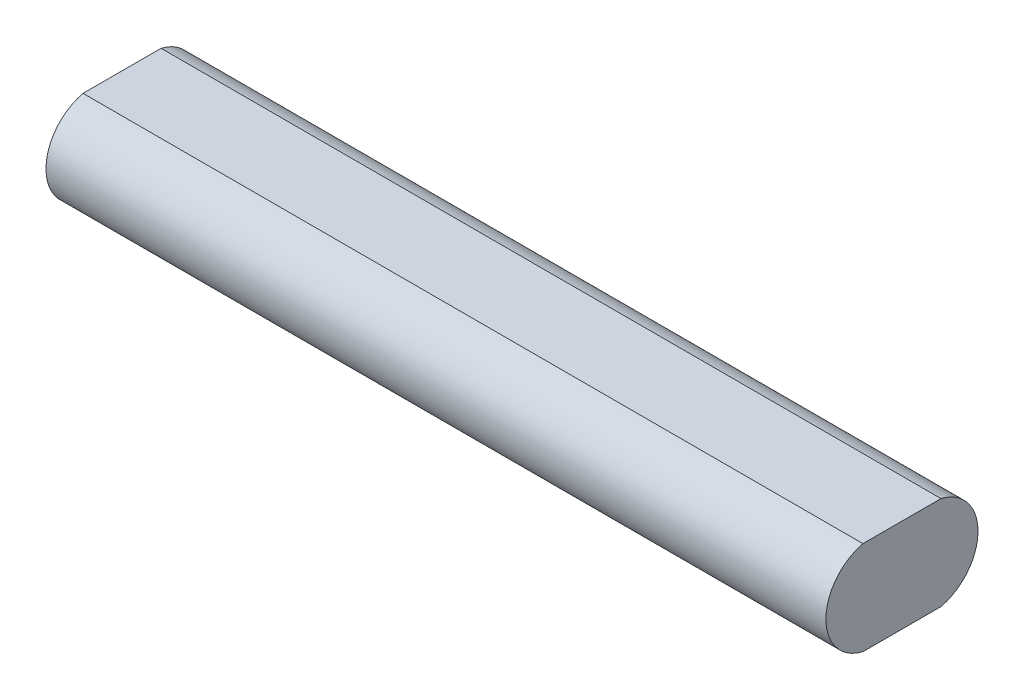
ISO-10303-21;
HEADER;
FILE_DESCRIPTION(('STEP AP214'),'2;1');
FILE_NAME('part.step','',(''),(''),'','','');
FILE_SCHEMA(('AUTOMOTIVE_DESIGN { 1 0 10303 214 1 1 1 1 }'));
ENDSEC;
DATA;
#1=APPLICATION_CONTEXT('core data for automotive mechanical design processes');
#2=APPLICATION_PROTOCOL_DEFINITION('international standard','automotive_design',2000,#1);
#3=PRODUCT_CONTEXT('',#1,'mechanical');
#4=PRODUCT('Part','Part','',(#3));
#5=PRODUCT_RELATED_PRODUCT_CATEGORY('part','',(#4));
#6=PRODUCT_DEFINITION_FORMATION('','',#4);
#7=PRODUCT_DEFINITION_CONTEXT('part definition',#1,'design');
#8=PRODUCT_DEFINITION('design','',#6,#7);
#9=PRODUCT_DEFINITION_SHAPE('','',#8);
#10=(LENGTH_UNIT() NAMED_UNIT(*) SI_UNIT(.MILLI.,.METRE.));
#11=(NAMED_UNIT(*) PLANE_ANGLE_UNIT() SI_UNIT($,.RADIAN.));
#12=(NAMED_UNIT(*) SI_UNIT($,.STERADIAN.) SOLID_ANGLE_UNIT());
#13=UNCERTAINTY_MEASURE_WITH_UNIT(LENGTH_MEASURE(1.E-05),#10,'distance_accuracy_value','');
#14=(GEOMETRIC_REPRESENTATION_CONTEXT(3) GLOBAL_UNCERTAINTY_ASSIGNED_CONTEXT((#13)) GLOBAL_UNIT_ASSIGNED_CONTEXT((#10,
#11,#12)) REPRESENTATION_CONTEXT('',''));
#15=CARTESIAN_POINT('',(0.,0.,0.));
#16=DIRECTION('',(0.,0.,1.));
#17=DIRECTION('',(1.,0.,0.));
#18=AXIS2_PLACEMENT_3D('',#15,#16,#17);
#19=CARTESIAN_POINT('',(20.,4.8,-4.));
#20=DIRECTION('',(1.,0.,0.));
#21=DIRECTION('',(0.,0.,-1.));
#22=AXIS2_PLACEMENT_3D('',#19,#20,#21);
#23=PLANE('',#22);
#24=DIRECTION('',(0.,0.,1.));
#25=VECTOR('',#24,1.);
#26=CARTESIAN_POINT('',(20.,0.,-4.));
#27=LINE('',#26,#25);
#28=CARTESIAN_POINT('',(20.,0.,-2.00135970489476));
#29=VERTEX_POINT('',#28);
#30=CARTESIAN_POINT('',(20.,0.,2.00135970489478));
#31=VERTEX_POINT('',#30);
#32=EDGE_CURVE('E47',#29,#31,#27,.T.);
#33=ORIENTED_EDGE('',*,*,#32,.F.);
#34=CARTESIAN_POINT('',(20.,2.39999999999999,-1.43380485120319));
#35=DIRECTION('',(1.,0.,0.));
#36=DIRECTION('',(0.,0.,-1.));
#37=AXIS2_PLACEMENT_3D('',#34,#35,#36);
#38=CIRCLE('',#37,2.4661951487968);
#39=CARTESIAN_POINT('',(20.,4.79999999999999,-2.00135970489478));
#40=VERTEX_POINT('',#39);
#41=EDGE_CURVE('E61',#29,#40,#38,.T.);
#42=ORIENTED_EDGE('',*,*,#41,.T.);
#43=DIRECTION('',(0.,0.,1.));
#44=VECTOR('',#43,1.);
#45=CARTESIAN_POINT('',(20.,4.8,-4.));
#46=LINE('',#45,#44);
#47=CARTESIAN_POINT('',(20.,4.8,2.00135970489478));
#48=VERTEX_POINT('',#47);
#49=EDGE_CURVE('E11',#40,#48,#46,.T.);
#50=ORIENTED_EDGE('',*,*,#49,.T.);
#51=CARTESIAN_POINT('',(20.,2.4,1.4338048512032));
#52=DIRECTION('',(-1.,0.,0.));
#53=DIRECTION('',(0.,0.,1.));
#54=AXIS2_PLACEMENT_3D('',#51,#52,#53);
#55=CIRCLE('',#54,2.4661951487968);
#56=EDGE_CURVE('E112',#31,#48,#55,.T.);
#57=ORIENTED_EDGE('',*,*,#56,.F.);
#58=EDGE_LOOP('',(#33,#42,#50,#57));
#59=FACE_BOUND('',#58,.T.);
#60=ADVANCED_FACE('F43',(#59),#23,.T.);
#61=CARTESIAN_POINT('',(-20.,4.8,-3.99999999999999));
#62=DIRECTION('',(1.,0.,0.));
#63=DIRECTION('',(0.,0.,-1.));
#64=AXIS2_PLACEMENT_3D('',#61,#62,#63);
#65=PLANE('',#64);
#66=CARTESIAN_POINT('',(-20.,2.39999999999999,-1.43380485120321));
#67=DIRECTION('',(1.,0.,0.));
#68=DIRECTION('',(0.,0.,-1.));
#69=AXIS2_PLACEMENT_3D('',#66,#67,#68);
#70=CIRCLE('',#69,2.4661951487968);
#71=CARTESIAN_POINT('',(-20.,0.,-2.00135970489478));
#72=VERTEX_POINT('',#71);
#73=CARTESIAN_POINT('',(-20.,4.79999999999999,-2.0013597048948));
#74=VERTEX_POINT('',#73);
#75=EDGE_CURVE('E87',#72,#74,#70,.T.);
#76=ORIENTED_EDGE('',*,*,#75,.F.);
#77=DIRECTION('',(0.,0.,1.));
#78=VECTOR('',#77,1.);
#79=CARTESIAN_POINT('',(-20.,0.,-3.99999999999999));
#80=LINE('',#79,#78);
#81=CARTESIAN_POINT('',(-20.,0.,2.00135970489476));
#82=VERTEX_POINT('',#81);
#83=EDGE_CURVE('E94',#72,#82,#80,.T.);
#84=ORIENTED_EDGE('',*,*,#83,.T.);
#85=CARTESIAN_POINT('',(-20.,2.4,1.43380485120318));
#86=DIRECTION('',(-1.,0.,0.));
#87=DIRECTION('',(0.,0.,1.));
#88=AXIS2_PLACEMENT_3D('',#85,#86,#87);
#89=CIRCLE('',#88,2.4661951487968);
#90=CARTESIAN_POINT('',(-20.,4.8,2.00135970489476));
#91=VERTEX_POINT('',#90);
#92=EDGE_CURVE('E69',#82,#91,#89,.T.);
#93=ORIENTED_EDGE('',*,*,#92,.T.);
#94=DIRECTION('',(0.,0.,1.));
#95=VECTOR('',#94,1.);
#96=CARTESIAN_POINT('',(-20.,4.8,-3.99999999999999));
#97=LINE('',#96,#95);
#98=EDGE_CURVE('E53',#74,#91,#97,.T.);
#99=ORIENTED_EDGE('',*,*,#98,.F.);
#100=EDGE_LOOP('',(#76,#84,#93,#99));
#101=FACE_BOUND('',#100,.T.);
#102=ADVANCED_FACE('F45',(#101),#65,.F.);
#103=CARTESIAN_POINT('',(0.,4.8,0.));
#104=DIRECTION('',(0.,1.,0.));
#105=DIRECTION('',(0.,0.,1.));
#106=AXIS2_PLACEMENT_3D('',#103,#104,#105);
#107=PLANE('',#106);
#108=ORIENTED_EDGE('',*,*,#49,.F.);
#109=DIRECTION('',(1.,0.,0.));
#110=VECTOR('',#109,1.);
#111=CARTESIAN_POINT('',(-20.,4.79999999999999,-2.0013597048948));
#112=LINE('',#111,#110);
#113=EDGE_CURVE('E95',#74,#40,#112,.T.);
#114=ORIENTED_EDGE('',*,*,#113,.F.);
#115=ORIENTED_EDGE('',*,*,#98,.T.);
#116=DIRECTION('',(1.,0.,0.));
#117=VECTOR('',#116,1.);
#118=CARTESIAN_POINT('',(-20.,4.8,2.00135970489476));
#119=LINE('',#118,#117);
#120=EDGE_CURVE('E115',#91,#48,#119,.T.);
#121=ORIENTED_EDGE('',*,*,#120,.T.);
#122=EDGE_LOOP('',(#108,#114,#115,#121));
#123=FACE_BOUND('',#122,.T.);
#124=ADVANCED_FACE('F128',(#123),#107,.T.);
#125=CARTESIAN_POINT('',(0.,0.,0.));
#126=DIRECTION('',(0.,1.,0.));
#127=DIRECTION('',(0.,0.,1.));
#128=AXIS2_PLACEMENT_3D('',#125,#126,#127);
#129=PLANE('',#128);
#130=DIRECTION('',(1.,0.,0.));
#131=VECTOR('',#130,1.);
#132=CARTESIAN_POINT('',(-20.,0.,-2.00135970489478));
#133=LINE('',#132,#131);
#134=EDGE_CURVE('E84',#72,#29,#133,.T.);
#135=ORIENTED_EDGE('',*,*,#134,.T.);
#136=ORIENTED_EDGE('',*,*,#32,.T.);
#137=DIRECTION('',(1.,0.,0.));
#138=VECTOR('',#137,1.);
#139=CARTESIAN_POINT('',(-20.,0.,2.00135970489476));
#140=LINE('',#139,#138);
#141=EDGE_CURVE('E104',#82,#31,#140,.T.);
#142=ORIENTED_EDGE('',*,*,#141,.F.);
#143=ORIENTED_EDGE('',*,*,#83,.F.);
#144=EDGE_LOOP('',(#135,#136,#142,#143));
#145=FACE_BOUND('',#144,.T.);
#146=ADVANCED_FACE('F103',(#145),#129,.F.);
#147=CARTESIAN_POINT('',(-20.,2.4,1.43380485120318));
#148=DIRECTION('',(1.,0.,0.));
#149=DIRECTION('',(0.,0.,-1.));
#150=AXIS2_PLACEMENT_3D('',#147,#148,#149);
#151=CYLINDRICAL_SURFACE('',#150,2.4661951487968);
#152=ORIENTED_EDGE('',*,*,#56,.T.);
#153=ORIENTED_EDGE('',*,*,#120,.F.);
#154=ORIENTED_EDGE('',*,*,#92,.F.);
#155=ORIENTED_EDGE('',*,*,#141,.T.);
#156=EDGE_LOOP('',(#152,#153,#154,#155));
#157=FACE_BOUND('',#156,.T.);
#158=ADVANCED_FACE('F129',(#157),#151,.T.);
#159=CARTESIAN_POINT('',(-20.,2.39999999999999,-1.43380485120321));
#160=DIRECTION('',(1.,0.,0.));
#161=DIRECTION('',(0.,0.,-1.));
#162=AXIS2_PLACEMENT_3D('',#159,#160,#161);
#163=CYLINDRICAL_SURFACE('',#162,2.4661951487968);
#164=ORIENTED_EDGE('',*,*,#41,.F.);
#165=ORIENTED_EDGE('',*,*,#134,.F.);
#166=ORIENTED_EDGE('',*,*,#75,.T.);
#167=ORIENTED_EDGE('',*,*,#113,.T.);
#168=EDGE_LOOP('',(#164,#165,#166,#167));
#169=FACE_BOUND('',#168,.T.);
#170=ADVANCED_FACE('F86',(#169),#163,.T.);
#171=CLOSED_SHELL('',(#60,#102,#124,#146,#158,#170));
#172=MANIFOLD_SOLID_BREP('B2',#171);
#173=ADVANCED_BREP_SHAPE_REPRESENTATION('',(#18,#172),#14);
#174=SHAPE_DEFINITION_REPRESENTATION(#9,#173);
ENDSEC;
END-ISO-10303-21;
